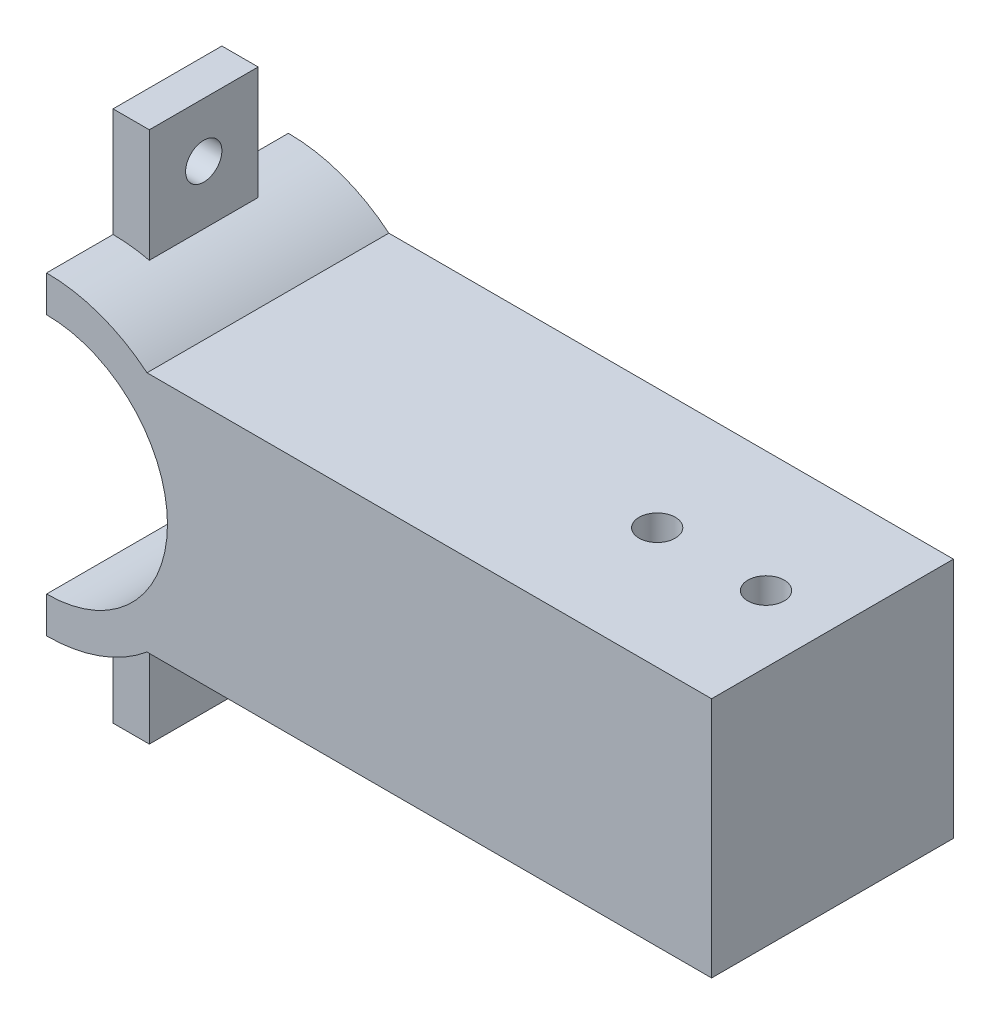
ISO-10303-21;
HEADER;
FILE_DESCRIPTION(('STEP AP214'),'2;1');
FILE_NAME('part.step','',(''),(''),'','','');
FILE_SCHEMA(('AUTOMOTIVE_DESIGN { 1 0 10303 214 1 1 1 1 }'));
ENDSEC;
DATA;
#1=APPLICATION_CONTEXT('core data for automotive mechanical design processes');
#2=APPLICATION_PROTOCOL_DEFINITION('international standard','automotive_design',2000,#1);
#3=PRODUCT_CONTEXT('',#1,'mechanical');
#4=PRODUCT('Part','Part','',(#3));
#5=PRODUCT_RELATED_PRODUCT_CATEGORY('part','',(#4));
#6=PRODUCT_DEFINITION_FORMATION('','',#4);
#7=PRODUCT_DEFINITION_CONTEXT('part definition',#1,'design');
#8=PRODUCT_DEFINITION('design','',#6,#7);
#9=PRODUCT_DEFINITION_SHAPE('','',#8);
#10=(LENGTH_UNIT() NAMED_UNIT(*) SI_UNIT(.MILLI.,.METRE.));
#11=(NAMED_UNIT(*) PLANE_ANGLE_UNIT() SI_UNIT($,.RADIAN.));
#12=(NAMED_UNIT(*) SI_UNIT($,.STERADIAN.) SOLID_ANGLE_UNIT());
#13=UNCERTAINTY_MEASURE_WITH_UNIT(LENGTH_MEASURE(1.E-05),#10,'distance_accuracy_value','');
#14=(GEOMETRIC_REPRESENTATION_CONTEXT(3) GLOBAL_UNCERTAINTY_ASSIGNED_CONTEXT((#13)) GLOBAL_UNIT_ASSIGNED_CONTEXT((#10,
#11,#12)) REPRESENTATION_CONTEXT('',''));
#15=CARTESIAN_POINT('',(0.,0.,0.));
#16=DIRECTION('',(0.,0.,1.));
#17=DIRECTION('',(1.,0.,0.));
#18=AXIS2_PLACEMENT_3D('',#15,#16,#17);
#19=CARTESIAN_POINT('',(0.,0.,20.));
#20=DIRECTION('',(0.,0.,-1.));
#21=DIRECTION('',(-1.,0.,0.));
#22=AXIS2_PLACEMENT_3D('',#19,#20,#21);
#23=CYLINDRICAL_SURFACE('',#22,10.);
#24=CARTESIAN_POINT('',(0.,0.,0.));
#25=DIRECTION('',(0.,0.,-1.));
#26=DIRECTION('',(-1.,0.,0.));
#27=AXIS2_PLACEMENT_3D('',#24,#25,#26);
#28=CIRCLE('',#27,10.);
#29=CARTESIAN_POINT('',(0.,10.,0.));
#30=VERTEX_POINT('',#29);
#31=CARTESIAN_POINT('',(0.,-10.,0.));
#32=VERTEX_POINT('',#31);
#33=EDGE_CURVE('E250',#30,#32,#28,.T.);
#34=ORIENTED_EDGE('',*,*,#33,.T.);
#35=DIRECTION('',(0.,0.,-1.));
#36=VECTOR('',#35,1.);
#37=CARTESIAN_POINT('',(0.,-10.,20.));
#38=LINE('',#37,#36);
#39=CARTESIAN_POINT('',(0.,-10.,20.));
#40=VERTEX_POINT('',#39);
#41=EDGE_CURVE('E332',#40,#32,#38,.T.);
#42=ORIENTED_EDGE('',*,*,#41,.F.);
#43=CARTESIAN_POINT('',(0.,0.,20.));
#44=DIRECTION('',(0.,0.,-1.));
#45=DIRECTION('',(-1.,0.,0.));
#46=AXIS2_PLACEMENT_3D('',#43,#44,#45);
#47=CIRCLE('',#46,10.);
#48=CARTESIAN_POINT('',(0.,10.,20.));
#49=VERTEX_POINT('',#48);
#50=EDGE_CURVE('E251',#49,#40,#47,.T.);
#51=ORIENTED_EDGE('',*,*,#50,.F.);
#52=DIRECTION('',(0.,0.,-1.));
#53=VECTOR('',#52,1.);
#54=CARTESIAN_POINT('',(0.,10.,20.));
#55=LINE('',#54,#53);
#56=EDGE_CURVE('E277',#49,#30,#55,.T.);
#57=ORIENTED_EDGE('',*,*,#56,.T.);
#58=EDGE_LOOP('',(#34,#42,#51,#57));
#59=FACE_BOUND('',#58,.T.);
#60=ADVANCED_FACE('F39',(#59),#23,.F.);
#61=CARTESIAN_POINT('',(0.,-10.,20.));
#62=DIRECTION('',(1.,0.,0.));
#63=DIRECTION('',(0.,0.,-1.));
#64=AXIS2_PLACEMENT_3D('',#61,#62,#63);
#65=PLANE('',#64);
#66=DIRECTION('',(0.,0.,-1.));
#67=VECTOR('',#66,1.);
#68=CARTESIAN_POINT('',(0.,-13.,20.));
#69=LINE('',#68,#67);
#70=CARTESIAN_POINT('',(0.,-13.,5.5));
#71=VERTEX_POINT('',#70);
#72=CARTESIAN_POINT('',(0.,-13.,0.));
#73=VERTEX_POINT('',#72);
#74=EDGE_CURVE('E328',#71,#73,#69,.T.);
#75=ORIENTED_EDGE('',*,*,#74,.F.);
#76=DIRECTION('',(0.,-1.,0.));
#77=VECTOR('',#76,1.);
#78=CARTESIAN_POINT('',(0.,-10.,5.5));
#79=LINE('',#78,#77);
#80=CARTESIAN_POINT('',(0.,-22.,5.5));
#81=VERTEX_POINT('',#80);
#82=EDGE_CURVE('E179',#71,#81,#79,.T.);
#83=ORIENTED_EDGE('',*,*,#82,.T.);
#84=DIRECTION('',(0.,0.,1.));
#85=VECTOR('',#84,1.);
#86=CARTESIAN_POINT('',(0.,-22.,5.5));
#87=LINE('',#86,#85);
#88=CARTESIAN_POINT('',(0.,-22.,14.5));
#89=VERTEX_POINT('',#88);
#90=EDGE_CURVE('E166',#81,#89,#87,.T.);
#91=ORIENTED_EDGE('',*,*,#90,.T.);
#92=DIRECTION('',(0.,1.,0.));
#93=VECTOR('',#92,1.);
#94=CARTESIAN_POINT('',(0.,-22.,14.5));
#95=LINE('',#94,#93);
#96=CARTESIAN_POINT('',(0.,-13.,14.5));
#97=VERTEX_POINT('',#96);
#98=EDGE_CURVE('E159',#89,#97,#95,.T.);
#99=ORIENTED_EDGE('',*,*,#98,.T.);
#100=CARTESIAN_POINT('',(0.,-13.,20.));
#101=VERTEX_POINT('',#100);
#102=EDGE_CURVE('E329',#101,#97,#69,.T.);
#103=ORIENTED_EDGE('',*,*,#102,.F.);
#104=DIRECTION('',(0.,-1.,0.));
#105=VECTOR('',#104,1.);
#106=CARTESIAN_POINT('',(0.,-10.,20.));
#107=LINE('',#106,#105);
#108=EDGE_CURVE('E255',#40,#101,#107,.T.);
#109=ORIENTED_EDGE('',*,*,#108,.F.);
#110=ORIENTED_EDGE('',*,*,#41,.T.);
#111=DIRECTION('',(0.,-1.,0.));
#112=VECTOR('',#111,1.);
#113=CARTESIAN_POINT('',(0.,-10.,0.));
#114=LINE('',#113,#112);
#115=EDGE_CURVE('E281',#32,#73,#114,.T.);
#116=ORIENTED_EDGE('',*,*,#115,.T.);
#117=EDGE_LOOP('',(#75,#83,#91,#99,#103,#109,#110,#116));
#118=FACE_BOUND('',#117,.T.);
#119=CARTESIAN_POINT('',(0.,-17.5,10.));
#120=DIRECTION('',(-1.,0.,0.));
#121=DIRECTION('',(0.,0.,1.));
#122=AXIS2_PLACEMENT_3D('',#119,#120,#121);
#123=CIRCLE('',#122,1.5);
#124=CARTESIAN_POINT('',(0.,-17.5,11.5));
#125=VERTEX_POINT('',#124);
#126=EDGE_CURVE('E467',#125,#125,#123,.T.);
#127=ORIENTED_EDGE('',*,*,#126,.F.);
#128=EDGE_LOOP('',(#127));
#129=FACE_BOUND('',#128,.T.);
#130=ADVANCED_FACE('F343',(#118,#129),#65,.F.);
#131=CARTESIAN_POINT('',(0.,0.,20.));
#132=DIRECTION('',(0.,0.,-1.));
#133=DIRECTION('',(-1.,0.,0.));
#134=AXIS2_PLACEMENT_3D('',#131,#132,#133);
#135=CYLINDRICAL_SURFACE('',#134,13.);
#136=ORIENTED_EDGE('',*,*,#102,.T.);
#137=CARTESIAN_POINT('',(0.,0.,14.5));
#138=DIRECTION('',(0.,0.,1.));
#139=DIRECTION('',(1.,0.,0.));
#140=AXIS2_PLACEMENT_3D('',#137,#138,#139);
#141=CIRCLE('',#140,13.);
#142=CARTESIAN_POINT('',(3.,-12.6491106406735,14.5));
#143=VERTEX_POINT('',#142);
#144=EDGE_CURVE('E11',#97,#143,#141,.T.);
#145=ORIENTED_EDGE('',*,*,#144,.T.);
#146=DIRECTION('',(0.,0.,-1.));
#147=VECTOR('',#146,1.);
#148=CARTESIAN_POINT('',(3.,-12.6491106406735,20.));
#149=LINE('',#148,#147);
#150=CARTESIAN_POINT('',(3.,-12.6491106406735,5.5));
#151=VERTEX_POINT('',#150);
#152=EDGE_CURVE('E56',#151,#143,#149,.F.);
#153=ORIENTED_EDGE('',*,*,#152,.F.);
#154=CARTESIAN_POINT('',(0.,0.,5.5));
#155=DIRECTION('',(0.,0.,-1.));
#156=DIRECTION('',(-1.,0.,0.));
#157=AXIS2_PLACEMENT_3D('',#154,#155,#156);
#158=CIRCLE('',#157,13.);
#159=EDGE_CURVE('E47',#151,#71,#158,.T.);
#160=ORIENTED_EDGE('',*,*,#159,.T.);
#161=ORIENTED_EDGE('',*,*,#74,.T.);
#162=CARTESIAN_POINT('',(0.,0.,0.));
#163=DIRECTION('',(0.,0.,1.));
#164=DIRECTION('',(1.,0.,0.));
#165=AXIS2_PLACEMENT_3D('',#162,#163,#164);
#166=CIRCLE('',#165,13.);
#167=CARTESIAN_POINT('',(8.30662386291807,-10.,0.));
#168=VERTEX_POINT('',#167);
#169=EDGE_CURVE('E285',#73,#168,#166,.T.);
#170=ORIENTED_EDGE('',*,*,#169,.T.);
#171=DIRECTION('',(0.,0.,-1.));
#172=VECTOR('',#171,1.);
#173=CARTESIAN_POINT('',(8.30662386291807,-10.,20.));
#174=LINE('',#173,#172);
#175=CARTESIAN_POINT('',(8.30662386291807,-10.,20.));
#176=VERTEX_POINT('',#175);
#177=EDGE_CURVE('E324',#176,#168,#174,.T.);
#178=ORIENTED_EDGE('',*,*,#177,.F.);
#179=CARTESIAN_POINT('',(0.,0.,20.));
#180=DIRECTION('',(0.,0.,1.));
#181=DIRECTION('',(1.,0.,0.));
#182=AXIS2_PLACEMENT_3D('',#179,#180,#181);
#183=CIRCLE('',#182,13.);
#184=EDGE_CURVE('E259',#101,#176,#183,.T.);
#185=ORIENTED_EDGE('',*,*,#184,.F.);
#186=EDGE_LOOP('',(#136,#145,#153,#160,#161,#170,#178,#185));
#187=FACE_BOUND('',#186,.T.);
#188=ADVANCED_FACE('F341',(#187),#135,.T.);
#189=CARTESIAN_POINT('',(55.,-10.,20.));
#190=DIRECTION('',(0.,1.,0.));
#191=DIRECTION('',(0.,0.,1.));
#192=AXIS2_PLACEMENT_3D('',#189,#190,#191);
#193=PLANE('',#192);
#194=CARTESIAN_POINT('',(40.5,-10.,10.));
#195=DIRECTION('',(0.,1.,0.));
#196=DIRECTION('',(0.,0.,1.));
#197=AXIS2_PLACEMENT_3D('',#194,#195,#196);
#198=CIRCLE('',#197,1.5);
#199=CARTESIAN_POINT('',(40.5,-10.,11.5));
#200=VERTEX_POINT('',#199);
#201=EDGE_CURVE('E246',#200,#200,#198,.T.);
#202=ORIENTED_EDGE('',*,*,#201,.T.);
#203=EDGE_LOOP('',(#202));
#204=FACE_BOUND('',#203,.T.);
#205=CARTESIAN_POINT('',(49.5,-10.,10.));
#206=DIRECTION('',(0.,1.,0.));
#207=DIRECTION('',(0.,0.,1.));
#208=AXIS2_PLACEMENT_3D('',#205,#206,#207);
#209=CIRCLE('',#208,1.5);
#210=CARTESIAN_POINT('',(49.5,-10.,11.5));
#211=VERTEX_POINT('',#210);
#212=EDGE_CURVE('E239',#211,#211,#209,.T.);
#213=ORIENTED_EDGE('',*,*,#212,.T.);
#214=EDGE_LOOP('',(#213));
#215=FACE_BOUND('',#214,.T.);
#216=DIRECTION('',(1.,0.,0.));
#217=VECTOR('',#216,1.);
#218=CARTESIAN_POINT('',(55.,-10.,0.));
#219=LINE('',#218,#217);
#220=CARTESIAN_POINT('',(55.,-10.,0.));
#221=VERTEX_POINT('',#220);
#222=EDGE_CURVE('E288',#168,#221,#219,.T.);
#223=ORIENTED_EDGE('',*,*,#222,.T.);
#224=DIRECTION('',(0.,0.,-1.));
#225=VECTOR('',#224,1.);
#226=CARTESIAN_POINT('',(55.,-10.,20.));
#227=LINE('',#226,#225);
#228=CARTESIAN_POINT('',(55.,-10.,20.));
#229=VERTEX_POINT('',#228);
#230=EDGE_CURVE('E320',#229,#221,#227,.T.);
#231=ORIENTED_EDGE('',*,*,#230,.F.);
#232=DIRECTION('',(1.,0.,0.));
#233=VECTOR('',#232,1.);
#234=CARTESIAN_POINT('',(55.,-10.,20.));
#235=LINE('',#234,#233);
#236=EDGE_CURVE('E262',#176,#229,#235,.T.);
#237=ORIENTED_EDGE('',*,*,#236,.F.);
#238=ORIENTED_EDGE('',*,*,#177,.T.);
#239=EDGE_LOOP('',(#223,#231,#237,#238));
#240=FACE_BOUND('',#239,.T.);
#241=ADVANCED_FACE('F406',(#204,#215,#240),#193,.F.);
#242=CARTESIAN_POINT('',(55.,10.,20.));
#243=DIRECTION('',(-1.,0.,0.));
#244=DIRECTION('',(0.,0.,1.));
#245=AXIS2_PLACEMENT_3D('',#242,#243,#244);
#246=PLANE('',#245);
#247=DIRECTION('',(0.,1.,0.));
#248=VECTOR('',#247,1.);
#249=CARTESIAN_POINT('',(55.,10.,0.));
#250=LINE('',#249,#248);
#251=CARTESIAN_POINT('',(55.,10.,0.));
#252=VERTEX_POINT('',#251);
#253=EDGE_CURVE('E292',#221,#252,#250,.T.);
#254=ORIENTED_EDGE('',*,*,#253,.T.);
#255=DIRECTION('',(0.,0.,-1.));
#256=VECTOR('',#255,1.);
#257=CARTESIAN_POINT('',(55.,10.,20.));
#258=LINE('',#257,#256);
#259=CARTESIAN_POINT('',(55.,10.,20.));
#260=VERTEX_POINT('',#259);
#261=EDGE_CURVE('E316',#260,#252,#258,.T.);
#262=ORIENTED_EDGE('',*,*,#261,.F.);
#263=DIRECTION('',(0.,1.,0.));
#264=VECTOR('',#263,1.);
#265=CARTESIAN_POINT('',(55.,0.,20.));
#266=LINE('',#265,#264);
#267=EDGE_CURVE('E265',#229,#260,#266,.T.);
#268=ORIENTED_EDGE('',*,*,#267,.F.);
#269=ORIENTED_EDGE('',*,*,#230,.T.);
#270=EDGE_LOOP('',(#254,#262,#268,#269));
#271=FACE_BOUND('',#270,.T.);
#272=ADVANCED_FACE('F411',(#271),#246,.F.);
#273=CARTESIAN_POINT('',(8.30662386291807,10.,20.));
#274=DIRECTION('',(0.,-1.,0.));
#275=DIRECTION('',(0.,0.,-1.));
#276=AXIS2_PLACEMENT_3D('',#273,#274,#275);
#277=PLANE('',#276);
#278=CARTESIAN_POINT('',(40.5,10.,10.));
#279=DIRECTION('',(0.,1.,0.));
#280=DIRECTION('',(0.,0.,1.));
#281=AXIS2_PLACEMENT_3D('',#278,#279,#280);
#282=CIRCLE('',#281,1.5);
#283=CARTESIAN_POINT('',(40.5,10.,11.5));
#284=VERTEX_POINT('',#283);
#285=EDGE_CURVE('E235',#284,#284,#282,.T.);
#286=ORIENTED_EDGE('',*,*,#285,.F.);
#287=EDGE_LOOP('',(#286));
#288=FACE_BOUND('',#287,.T.);
#289=CARTESIAN_POINT('',(49.5,10.,10.));
#290=DIRECTION('',(0.,1.,0.));
#291=DIRECTION('',(0.,0.,1.));
#292=AXIS2_PLACEMENT_3D('',#289,#290,#291);
#293=CIRCLE('',#292,1.5);
#294=CARTESIAN_POINT('',(49.5,10.,11.5));
#295=VERTEX_POINT('',#294);
#296=EDGE_CURVE('E234',#295,#295,#293,.T.);
#297=ORIENTED_EDGE('',*,*,#296,.F.);
#298=EDGE_LOOP('',(#297));
#299=FACE_BOUND('',#298,.T.);
#300=DIRECTION('',(-1.,0.,0.));
#301=VECTOR('',#300,1.);
#302=CARTESIAN_POINT('',(8.30662386291807,10.,0.));
#303=LINE('',#302,#301);
#304=CARTESIAN_POINT('',(8.30662386291807,10.,0.));
#305=VERTEX_POINT('',#304);
#306=EDGE_CURVE('E295',#252,#305,#303,.T.);
#307=ORIENTED_EDGE('',*,*,#306,.T.);
#308=DIRECTION('',(0.,0.,-1.));
#309=VECTOR('',#308,1.);
#310=CARTESIAN_POINT('',(8.30662386291807,10.,20.));
#311=LINE('',#310,#309);
#312=CARTESIAN_POINT('',(8.30662386291807,10.,20.));
#313=VERTEX_POINT('',#312);
#314=EDGE_CURVE('E312',#313,#305,#311,.T.);
#315=ORIENTED_EDGE('',*,*,#314,.F.);
#316=DIRECTION('',(-1.,0.,0.));
#317=VECTOR('',#316,1.);
#318=CARTESIAN_POINT('',(8.30662386291807,10.,20.));
#319=LINE('',#318,#317);
#320=EDGE_CURVE('E268',#260,#313,#319,.T.);
#321=ORIENTED_EDGE('',*,*,#320,.F.);
#322=ORIENTED_EDGE('',*,*,#261,.T.);
#323=EDGE_LOOP('',(#307,#315,#321,#322));
#324=FACE_BOUND('',#323,.T.);
#325=ADVANCED_FACE('F415',(#288,#299,#324),#277,.F.);
#326=CARTESIAN_POINT('',(0.,0.,20.));
#327=DIRECTION('',(0.,0.,-1.));
#328=DIRECTION('',(-1.,0.,0.));
#329=AXIS2_PLACEMENT_3D('',#326,#327,#328);
#330=CYLINDRICAL_SURFACE('',#329,13.);
#331=DIRECTION('',(0.,0.,-1.));
#332=VECTOR('',#331,1.);
#333=CARTESIAN_POINT('',(0.,13.,20.));
#334=LINE('',#333,#332);
#335=CARTESIAN_POINT('',(0.,13.,5.5));
#336=VERTEX_POINT('',#335);
#337=CARTESIAN_POINT('',(0.,13.,0.));
#338=VERTEX_POINT('',#337);
#339=EDGE_CURVE('E307',#336,#338,#334,.T.);
#340=ORIENTED_EDGE('',*,*,#339,.F.);
#341=CARTESIAN_POINT('',(0.,0.,5.5));
#342=DIRECTION('',(0.,0.,-1.));
#343=DIRECTION('',(-1.,0.,0.));
#344=AXIS2_PLACEMENT_3D('',#341,#342,#343);
#345=CIRCLE('',#344,13.);
#346=CARTESIAN_POINT('',(3.,12.6491106406735,5.5));
#347=VERTEX_POINT('',#346);
#348=EDGE_CURVE('E230',#336,#347,#345,.T.);
#349=ORIENTED_EDGE('',*,*,#348,.T.);
#350=DIRECTION('',(0.,0.,-1.));
#351=VECTOR('',#350,1.);
#352=CARTESIAN_POINT('',(3.,12.6491106406735,20.));
#353=LINE('',#352,#351);
#354=CARTESIAN_POINT('',(3.,12.6491106406735,14.5));
#355=VERTEX_POINT('',#354);
#356=EDGE_CURVE('E335',#347,#355,#353,.F.);
#357=ORIENTED_EDGE('',*,*,#356,.T.);
#358=CARTESIAN_POINT('',(0.,0.,14.5));
#359=DIRECTION('',(0.,0.,1.));
#360=DIRECTION('',(1.,0.,0.));
#361=AXIS2_PLACEMENT_3D('',#358,#359,#360);
#362=CIRCLE('',#361,13.);
#363=CARTESIAN_POINT('',(0.,13.,14.5));
#364=VERTEX_POINT('',#363);
#365=EDGE_CURVE('E223',#355,#364,#362,.T.);
#366=ORIENTED_EDGE('',*,*,#365,.T.);
#367=CARTESIAN_POINT('',(0.,13.,20.));
#368=VERTEX_POINT('',#367);
#369=EDGE_CURVE('E308',#368,#364,#334,.T.);
#370=ORIENTED_EDGE('',*,*,#369,.F.);
#371=CARTESIAN_POINT('',(0.,0.,20.));
#372=DIRECTION('',(0.,0.,1.));
#373=DIRECTION('',(-1.,0.,0.));
#374=AXIS2_PLACEMENT_3D('',#371,#372,#373);
#375=CIRCLE('',#374,13.);
#376=EDGE_CURVE('E271',#313,#368,#375,.T.);
#377=ORIENTED_EDGE('',*,*,#376,.F.);
#378=ORIENTED_EDGE('',*,*,#314,.T.);
#379=CARTESIAN_POINT('',(0.,0.,0.));
#380=DIRECTION('',(0.,0.,1.));
#381=DIRECTION('',(-1.,0.,0.));
#382=AXIS2_PLACEMENT_3D('',#379,#380,#381);
#383=CIRCLE('',#382,13.);
#384=EDGE_CURVE('E298',#305,#338,#383,.T.);
#385=ORIENTED_EDGE('',*,*,#384,.T.);
#386=EDGE_LOOP('',(#340,#349,#357,#366,#370,#377,#378,#385));
#387=FACE_BOUND('',#386,.T.);
#388=ADVANCED_FACE('F361',(#387),#330,.T.);
#389=CARTESIAN_POINT('',(0.,10.,20.));
#390=DIRECTION('',(1.,0.,0.));
#391=DIRECTION('',(0.,0.,-1.));
#392=AXIS2_PLACEMENT_3D('',#389,#390,#391);
#393=PLANE('',#392);
#394=ORIENTED_EDGE('',*,*,#369,.T.);
#395=DIRECTION('',(0.,1.,0.));
#396=VECTOR('',#395,1.);
#397=CARTESIAN_POINT('',(0.,22.,14.5));
#398=LINE('',#397,#396);
#399=CARTESIAN_POINT('',(0.,22.,14.5));
#400=VERTEX_POINT('',#399);
#401=EDGE_CURVE('E195',#364,#400,#398,.T.);
#402=ORIENTED_EDGE('',*,*,#401,.T.);
#403=DIRECTION('',(0.,0.,-1.));
#404=VECTOR('',#403,1.);
#405=CARTESIAN_POINT('',(0.,22.,5.5));
#406=LINE('',#405,#404);
#407=CARTESIAN_POINT('',(0.,22.,5.5));
#408=VERTEX_POINT('',#407);
#409=EDGE_CURVE('E214',#400,#408,#406,.T.);
#410=ORIENTED_EDGE('',*,*,#409,.T.);
#411=DIRECTION('',(0.,-1.,0.));
#412=VECTOR('',#411,1.);
#413=CARTESIAN_POINT('',(0.,10.,5.5));
#414=LINE('',#413,#412);
#415=EDGE_CURVE('E203',#408,#336,#414,.T.);
#416=ORIENTED_EDGE('',*,*,#415,.T.);
#417=ORIENTED_EDGE('',*,*,#339,.T.);
#418=DIRECTION('',(0.,-1.,0.));
#419=VECTOR('',#418,1.);
#420=CARTESIAN_POINT('',(0.,10.,0.));
#421=LINE('',#420,#419);
#422=EDGE_CURVE('E256',#338,#30,#421,.T.);
#423=ORIENTED_EDGE('',*,*,#422,.T.);
#424=ORIENTED_EDGE('',*,*,#56,.F.);
#425=DIRECTION('',(0.,-1.,0.));
#426=VECTOR('',#425,1.);
#427=CARTESIAN_POINT('',(0.,10.,20.));
#428=LINE('',#427,#426);
#429=EDGE_CURVE('E274',#368,#49,#428,.T.);
#430=ORIENTED_EDGE('',*,*,#429,.F.);
#431=EDGE_LOOP('',(#394,#402,#410,#416,#417,#423,#424,#430));
#432=FACE_BOUND('',#431,.T.);
#433=CARTESIAN_POINT('',(0.,17.5,10.));
#434=DIRECTION('',(-1.,0.,0.));
#435=DIRECTION('',(0.,0.,1.));
#436=AXIS2_PLACEMENT_3D('',#433,#434,#435);
#437=CIRCLE('',#436,1.5);
#438=CARTESIAN_POINT('',(0.,17.5,11.5));
#439=VERTEX_POINT('',#438);
#440=EDGE_CURVE('E189',#439,#439,#437,.T.);
#441=ORIENTED_EDGE('',*,*,#440,.F.);
#442=EDGE_LOOP('',(#441));
#443=FACE_BOUND('',#442,.T.);
#444=ADVANCED_FACE('F352',(#432,#443),#393,.F.);
#445=CARTESIAN_POINT('',(0.,0.,20.));
#446=DIRECTION('',(0.,0.,-1.));
#447=DIRECTION('',(-1.,0.,0.));
#448=AXIS2_PLACEMENT_3D('',#445,#446,#447);
#449=PLANE('',#448);
#450=ORIENTED_EDGE('',*,*,#50,.T.);
#451=ORIENTED_EDGE('',*,*,#108,.T.);
#452=ORIENTED_EDGE('',*,*,#184,.T.);
#453=ORIENTED_EDGE('',*,*,#236,.T.);
#454=ORIENTED_EDGE('',*,*,#267,.T.);
#455=ORIENTED_EDGE('',*,*,#320,.T.);
#456=ORIENTED_EDGE('',*,*,#376,.T.);
#457=ORIENTED_EDGE('',*,*,#429,.T.);
#458=EDGE_LOOP('',(#450,#451,#452,#453,#454,#455,#456,#457));
#459=FACE_BOUND('',#458,.T.);
#460=ADVANCED_FACE('F373',(#459),#449,.F.);
#461=CARTESIAN_POINT('',(0.,0.,0.));
#462=DIRECTION('',(0.,0.,-1.));
#463=DIRECTION('',(-1.,0.,0.));
#464=AXIS2_PLACEMENT_3D('',#461,#462,#463);
#465=PLANE('',#464);
#466=ORIENTED_EDGE('',*,*,#33,.F.);
#467=ORIENTED_EDGE('',*,*,#422,.F.);
#468=ORIENTED_EDGE('',*,*,#384,.F.);
#469=ORIENTED_EDGE('',*,*,#306,.F.);
#470=ORIENTED_EDGE('',*,*,#253,.F.);
#471=ORIENTED_EDGE('',*,*,#222,.F.);
#472=ORIENTED_EDGE('',*,*,#169,.F.);
#473=ORIENTED_EDGE('',*,*,#115,.F.);
#474=EDGE_LOOP('',(#466,#467,#468,#469,#470,#471,#472,#473));
#475=FACE_BOUND('',#474,.T.);
#476=ADVANCED_FACE('F366',(#475),#465,.T.);
#477=CARTESIAN_POINT('',(49.5,-13.,10.));
#478=DIRECTION('',(0.,1.,0.));
#479=DIRECTION('',(0.,0.,1.));
#480=AXIS2_PLACEMENT_3D('',#477,#478,#479);
#481=CYLINDRICAL_SURFACE('',#480,1.5);
#482=ORIENTED_EDGE('',*,*,#296,.T.);
#483=EDGE_LOOP('',(#482));
#484=FACE_BOUND('',#483,.T.);
#485=ORIENTED_EDGE('',*,*,#212,.F.);
#486=EDGE_LOOP('',(#485));
#487=FACE_BOUND('',#486,.T.);
#488=ADVANCED_FACE('F426',(#484,#487),#481,.F.);
#489=CARTESIAN_POINT('',(40.5,-13.,10.));
#490=DIRECTION('',(0.,1.,0.));
#491=DIRECTION('',(0.,0.,1.));
#492=AXIS2_PLACEMENT_3D('',#489,#490,#491);
#493=CYLINDRICAL_SURFACE('',#492,1.5);
#494=ORIENTED_EDGE('',*,*,#285,.T.);
#495=EDGE_LOOP('',(#494));
#496=FACE_BOUND('',#495,.T.);
#497=ORIENTED_EDGE('',*,*,#201,.F.);
#498=EDGE_LOOP('',(#497));
#499=FACE_BOUND('',#498,.T.);
#500=ADVANCED_FACE('F395',(#496,#499),#493,.F.);
#501=CARTESIAN_POINT('',(3.,0.,0.));
#502=DIRECTION('',(1.,0.,0.));
#503=DIRECTION('',(0.,0.,-1.));
#504=AXIS2_PLACEMENT_3D('',#501,#502,#503);
#505=PLANE('',#504);
#506=CARTESIAN_POINT('',(3.,17.5,10.));
#507=DIRECTION('',(-1.,0.,0.));
#508=DIRECTION('',(0.,0.,1.));
#509=AXIS2_PLACEMENT_3D('',#506,#507,#508);
#510=CIRCLE('',#509,1.5);
#511=CARTESIAN_POINT('',(3.,17.5,11.5));
#512=VERTEX_POINT('',#511);
#513=EDGE_CURVE('E191',#512,#512,#510,.T.);
#514=ORIENTED_EDGE('',*,*,#513,.T.);
#515=EDGE_LOOP('',(#514));
#516=FACE_BOUND('',#515,.T.);
#517=ORIENTED_EDGE('',*,*,#356,.F.);
#518=DIRECTION('',(0.,-1.,0.));
#519=VECTOR('',#518,1.);
#520=CARTESIAN_POINT('',(3.,10.,5.5));
#521=LINE('',#520,#519);
#522=CARTESIAN_POINT('',(3.,22.,5.5));
#523=VERTEX_POINT('',#522);
#524=EDGE_CURVE('E207',#523,#347,#521,.T.);
#525=ORIENTED_EDGE('',*,*,#524,.F.);
#526=DIRECTION('',(0.,0.,-1.));
#527=VECTOR('',#526,1.);
#528=CARTESIAN_POINT('',(3.,22.,5.5));
#529=LINE('',#528,#527);
#530=CARTESIAN_POINT('',(3.,22.,14.5));
#531=VERTEX_POINT('',#530);
#532=EDGE_CURVE('E202',#531,#523,#529,.T.);
#533=ORIENTED_EDGE('',*,*,#532,.F.);
#534=DIRECTION('',(0.,1.,0.));
#535=VECTOR('',#534,1.);
#536=CARTESIAN_POINT('',(3.,22.,14.5));
#537=LINE('',#536,#535);
#538=EDGE_CURVE('E199',#355,#531,#537,.T.);
#539=ORIENTED_EDGE('',*,*,#538,.F.);
#540=EDGE_LOOP('',(#517,#525,#533,#539));
#541=FACE_BOUND('',#540,.T.);
#542=ADVANCED_FACE('F381',(#516,#541),#505,.T.);
#543=CARTESIAN_POINT('',(3.,10.,5.5));
#544=DIRECTION('',(0.,0.,-1.));
#545=DIRECTION('',(-1.,0.,0.));
#546=AXIS2_PLACEMENT_3D('',#543,#544,#545);
#547=PLANE('',#546);
#548=ORIENTED_EDGE('',*,*,#348,.F.);
#549=ORIENTED_EDGE('',*,*,#415,.F.);
#550=DIRECTION('',(-1.,0.,0.));
#551=VECTOR('',#550,1.);
#552=CARTESIAN_POINT('',(3.,22.,5.5));
#553=LINE('',#552,#551);
#554=EDGE_CURVE('E220',#523,#408,#553,.T.);
#555=ORIENTED_EDGE('',*,*,#554,.F.);
#556=ORIENTED_EDGE('',*,*,#524,.T.);
#557=EDGE_LOOP('',(#548,#549,#555,#556));
#558=FACE_BOUND('',#557,.T.);
#559=ADVANCED_FACE('F387',(#558),#547,.T.);
#560=CARTESIAN_POINT('',(3.,22.,14.5));
#561=DIRECTION('',(0.,0.,1.));
#562=DIRECTION('',(1.,0.,0.));
#563=AXIS2_PLACEMENT_3D('',#560,#561,#562);
#564=PLANE('',#563);
#565=ORIENTED_EDGE('',*,*,#365,.F.);
#566=ORIENTED_EDGE('',*,*,#538,.T.);
#567=DIRECTION('',(-1.,0.,0.));
#568=VECTOR('',#567,1.);
#569=CARTESIAN_POINT('',(3.,22.,14.5));
#570=LINE('',#569,#568);
#571=EDGE_CURVE('E211',#531,#400,#570,.T.);
#572=ORIENTED_EDGE('',*,*,#571,.T.);
#573=ORIENTED_EDGE('',*,*,#401,.F.);
#574=EDGE_LOOP('',(#565,#566,#572,#573));
#575=FACE_BOUND('',#574,.T.);
#576=ADVANCED_FACE('F377',(#575),#564,.T.);
#577=CARTESIAN_POINT('',(3.,22.,5.5));
#578=DIRECTION('',(0.,1.,0.));
#579=DIRECTION('',(0.,0.,1.));
#580=AXIS2_PLACEMENT_3D('',#577,#578,#579);
#581=PLANE('',#580);
#582=ORIENTED_EDGE('',*,*,#409,.F.);
#583=ORIENTED_EDGE('',*,*,#571,.F.);
#584=ORIENTED_EDGE('',*,*,#532,.T.);
#585=ORIENTED_EDGE('',*,*,#554,.T.);
#586=EDGE_LOOP('',(#582,#583,#584,#585));
#587=FACE_BOUND('',#586,.T.);
#588=ADVANCED_FACE('F385',(#587),#581,.T.);
#589=CARTESIAN_POINT('',(3.,17.5,10.));
#590=DIRECTION('',(-1.,0.,0.));
#591=DIRECTION('',(0.,0.,1.));
#592=AXIS2_PLACEMENT_3D('',#589,#590,#591);
#593=CYLINDRICAL_SURFACE('',#592,1.5);
#594=ORIENTED_EDGE('',*,*,#513,.F.);
#595=EDGE_LOOP('',(#594));
#596=FACE_BOUND('',#595,.T.);
#597=ORIENTED_EDGE('',*,*,#440,.T.);
#598=EDGE_LOOP('',(#597));
#599=FACE_BOUND('',#598,.T.);
#600=ADVANCED_FACE('F435',(#596,#599),#593,.F.);
#601=CARTESIAN_POINT('',(3.,0.,0.));
#602=DIRECTION('',(-1.,0.,0.));
#603=DIRECTION('',(0.,0.,1.));
#604=AXIS2_PLACEMENT_3D('',#601,#602,#603);
#605=PLANE('',#604);
#606=CARTESIAN_POINT('',(3.,-17.5,10.));
#607=DIRECTION('',(-1.,0.,0.));
#608=DIRECTION('',(0.,0.,1.));
#609=AXIS2_PLACEMENT_3D('',#606,#607,#608);
#610=CIRCLE('',#609,1.5);
#611=CARTESIAN_POINT('',(3.,-17.5,11.5));
#612=VERTEX_POINT('',#611);
#613=EDGE_CURVE('E182',#612,#612,#610,.T.);
#614=ORIENTED_EDGE('',*,*,#613,.T.);
#615=EDGE_LOOP('',(#614));
#616=FACE_BOUND('',#615,.T.);
#617=DIRECTION('',(0.,-1.,0.));
#618=VECTOR('',#617,1.);
#619=CARTESIAN_POINT('',(3.,-10.,5.5));
#620=LINE('',#619,#618);
#621=CARTESIAN_POINT('',(3.,-22.,5.5));
#622=VERTEX_POINT('',#621);
#623=EDGE_CURVE('E149',#151,#622,#620,.T.);
#624=ORIENTED_EDGE('',*,*,#623,.F.);
#625=ORIENTED_EDGE('',*,*,#152,.T.);
#626=DIRECTION('',(0.,1.,0.));
#627=VECTOR('',#626,1.);
#628=CARTESIAN_POINT('',(3.,-22.,14.5));
#629=LINE('',#628,#627);
#630=CARTESIAN_POINT('',(3.,-22.,14.5));
#631=VERTEX_POINT('',#630);
#632=EDGE_CURVE('E169',#631,#143,#629,.T.);
#633=ORIENTED_EDGE('',*,*,#632,.F.);
#634=DIRECTION('',(0.,0.,1.));
#635=VECTOR('',#634,1.);
#636=CARTESIAN_POINT('',(3.,-22.,5.5));
#637=LINE('',#636,#635);
#638=EDGE_CURVE('E158',#622,#631,#637,.T.);
#639=ORIENTED_EDGE('',*,*,#638,.F.);
#640=EDGE_LOOP('',(#624,#625,#633,#639));
#641=FACE_BOUND('',#640,.T.);
#642=ADVANCED_FACE('F171',(#616,#641),#605,.F.);
#643=CARTESIAN_POINT('',(3.,-22.,14.5));
#644=DIRECTION('',(0.,0.,1.));
#645=DIRECTION('',(1.,0.,0.));
#646=AXIS2_PLACEMENT_3D('',#643,#644,#645);
#647=PLANE('',#646);
#648=ORIENTED_EDGE('',*,*,#144,.F.);
#649=ORIENTED_EDGE('',*,*,#98,.F.);
#650=DIRECTION('',(-1.,0.,0.));
#651=VECTOR('',#650,1.);
#652=CARTESIAN_POINT('',(3.,-22.,14.5));
#653=LINE('',#652,#651);
#654=EDGE_CURVE('E168',#631,#89,#653,.T.);
#655=ORIENTED_EDGE('',*,*,#654,.F.);
#656=ORIENTED_EDGE('',*,*,#632,.T.);
#657=EDGE_LOOP('',(#648,#649,#655,#656));
#658=FACE_BOUND('',#657,.T.);
#659=ADVANCED_FACE('F444',(#658),#647,.T.);
#660=CARTESIAN_POINT('',(3.,-22.,5.5));
#661=DIRECTION('',(0.,-1.,0.));
#662=DIRECTION('',(0.,0.,-1.));
#663=AXIS2_PLACEMENT_3D('',#660,#661,#662);
#664=PLANE('',#663);
#665=ORIENTED_EDGE('',*,*,#90,.F.);
#666=DIRECTION('',(-1.,0.,0.));
#667=VECTOR('',#666,1.);
#668=CARTESIAN_POINT('',(3.,-22.,5.5));
#669=LINE('',#668,#667);
#670=EDGE_CURVE('E153',#622,#81,#669,.T.);
#671=ORIENTED_EDGE('',*,*,#670,.F.);
#672=ORIENTED_EDGE('',*,*,#638,.T.);
#673=ORIENTED_EDGE('',*,*,#654,.T.);
#674=EDGE_LOOP('',(#665,#671,#672,#673));
#675=FACE_BOUND('',#674,.T.);
#676=ADVANCED_FACE('F163',(#675),#664,.T.);
#677=CARTESIAN_POINT('',(3.,-10.,5.5));
#678=DIRECTION('',(0.,0.,-1.));
#679=DIRECTION('',(-1.,0.,0.));
#680=AXIS2_PLACEMENT_3D('',#677,#678,#679);
#681=PLANE('',#680);
#682=ORIENTED_EDGE('',*,*,#159,.F.);
#683=ORIENTED_EDGE('',*,*,#623,.T.);
#684=ORIENTED_EDGE('',*,*,#670,.T.);
#685=ORIENTED_EDGE('',*,*,#82,.F.);
#686=EDGE_LOOP('',(#682,#683,#684,#685));
#687=FACE_BOUND('',#686,.T.);
#688=ADVANCED_FACE('F151',(#687),#681,.T.);
#689=CARTESIAN_POINT('',(3.,-17.5,10.));
#690=DIRECTION('',(-1.,0.,0.));
#691=DIRECTION('',(0.,0.,1.));
#692=AXIS2_PLACEMENT_3D('',#689,#690,#691);
#693=CYLINDRICAL_SURFACE('',#692,1.5);
#694=ORIENTED_EDGE('',*,*,#613,.F.);
#695=EDGE_LOOP('',(#694));
#696=FACE_BOUND('',#695,.T.);
#697=ORIENTED_EDGE('',*,*,#126,.T.);
#698=EDGE_LOOP('',(#697));
#699=FACE_BOUND('',#698,.T.);
#700=ADVANCED_FACE('F452',(#696,#699),#693,.F.);
#701=CLOSED_SHELL('',(#60,#130,#188,#241,#272,#325,#388,#444,#460,#476,#488,#500,#542,#559,#576,
#588,#600,#642,#659,#676,#688,#700));
#702=MANIFOLD_SOLID_BREP('B2',#701);
#703=ADVANCED_BREP_SHAPE_REPRESENTATION('',(#18,#702),#14);
#704=SHAPE_DEFINITION_REPRESENTATION(#9,#703);
ENDSEC;
END-ISO-10303-21;
